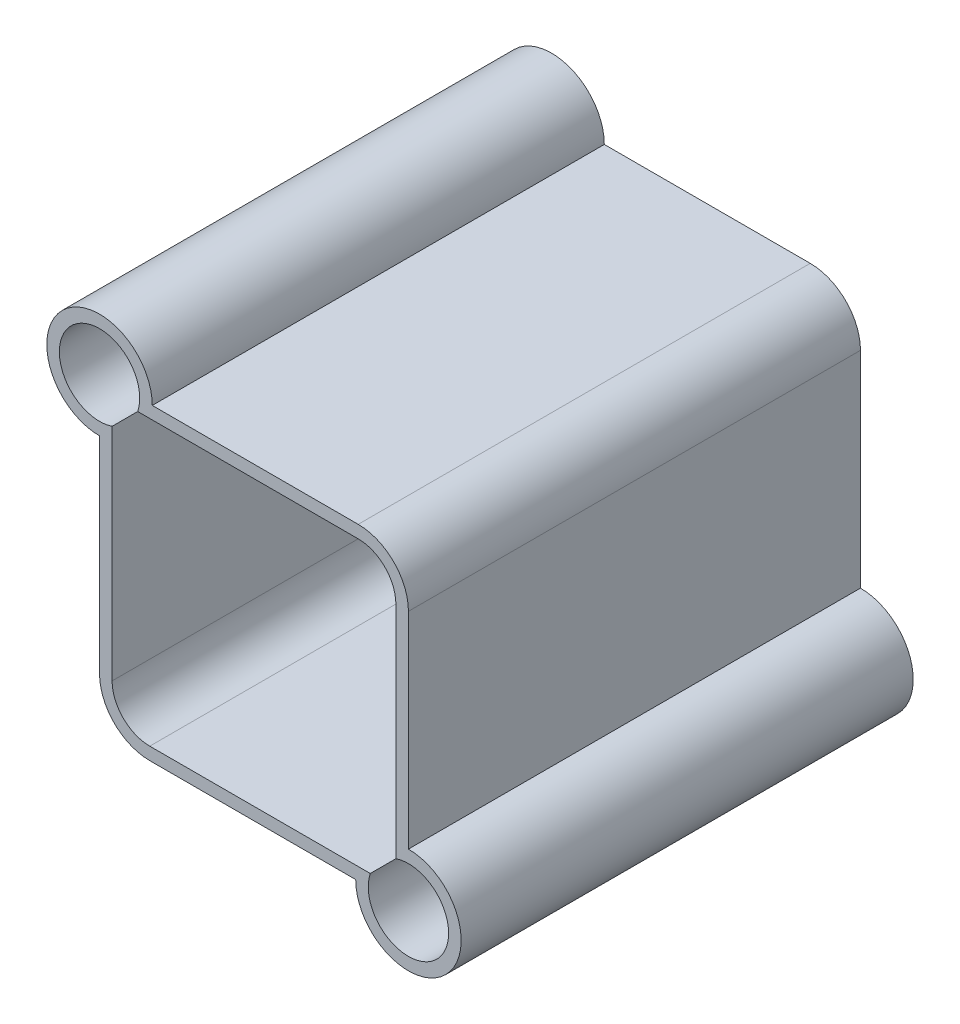
ISO-10303-21;
HEADER;
FILE_DESCRIPTION(('STEP AP214'),'2;1');
FILE_NAME('part.step','',(''),(''),'','','');
FILE_SCHEMA(('AUTOMOTIVE_DESIGN { 1 0 10303 214 1 1 1 1 }'));
ENDSEC;
DATA;
#1=APPLICATION_CONTEXT('core data for automotive mechanical design processes');
#2=APPLICATION_PROTOCOL_DEFINITION('international standard','automotive_design',2000,#1);
#3=PRODUCT_CONTEXT('',#1,'mechanical');
#4=PRODUCT('Part','Part','',(#3));
#5=PRODUCT_RELATED_PRODUCT_CATEGORY('part','',(#4));
#6=PRODUCT_DEFINITION_FORMATION('','',#4);
#7=PRODUCT_DEFINITION_CONTEXT('part definition',#1,'design');
#8=PRODUCT_DEFINITION('design','',#6,#7);
#9=PRODUCT_DEFINITION_SHAPE('','',#8);
#10=(LENGTH_UNIT() NAMED_UNIT(*) SI_UNIT(.MILLI.,.METRE.));
#11=(NAMED_UNIT(*) PLANE_ANGLE_UNIT() SI_UNIT($,.RADIAN.));
#12=(NAMED_UNIT(*) SI_UNIT($,.STERADIAN.) SOLID_ANGLE_UNIT());
#13=UNCERTAINTY_MEASURE_WITH_UNIT(LENGTH_MEASURE(1.E-05),#10,'distance_accuracy_value','');
#14=(GEOMETRIC_REPRESENTATION_CONTEXT(3) GLOBAL_UNCERTAINTY_ASSIGNED_CONTEXT((#13)) GLOBAL_UNIT_ASSIGNED_CONTEXT((#10,
#11,#12)) REPRESENTATION_CONTEXT('',''));
#15=CARTESIAN_POINT('',(0.,0.,0.));
#16=DIRECTION('',(0.,0.,1.));
#17=DIRECTION('',(1.,0.,0.));
#18=AXIS2_PLACEMENT_3D('',#15,#16,#17);
#19=CARTESIAN_POINT('',(-6.15,6.15,30.5));
#20=DIRECTION('',(0.,0.,1.));
#21=DIRECTION('',(1.,0.,0.));
#22=AXIS2_PLACEMENT_3D('',#19,#20,#21);
#23=PLANE('',#22);
#24=CARTESIAN_POINT('',(-6.15,6.15,30.5));
#25=DIRECTION('',(0.,0.,1.));
#26=DIRECTION('',(1.,0.,0.));
#27=AXIS2_PLACEMENT_3D('',#24,#25,#26);
#28=CIRCLE('',#27,2.1);
#29=CARTESIAN_POINT('',(-4.05,6.15,30.5));
#30=VERTEX_POINT('',#29);
#31=CARTESIAN_POINT('',(-6.15,4.05,30.5));
#32=VERTEX_POINT('',#31);
#33=EDGE_CURVE('E220',#30,#32,#28,.T.);
#34=ORIENTED_EDGE('',*,*,#33,.T.);
#35=DIRECTION('',(0.,-1.,0.));
#36=VECTOR('',#35,1.);
#37=CARTESIAN_POINT('',(-6.15,4.05,30.5));
#38=LINE('',#37,#36);
#39=CARTESIAN_POINT('',(-6.15,-4.15,30.5));
#40=VERTEX_POINT('',#39);
#41=EDGE_CURVE('E223',#32,#40,#38,.T.);
#42=ORIENTED_EDGE('',*,*,#41,.T.);
#43=CARTESIAN_POINT('',(-4.15,-4.15,30.5));
#44=DIRECTION('',(0.,0.,1.));
#45=DIRECTION('',(1.,0.,0.));
#46=AXIS2_PLACEMENT_3D('',#43,#44,#45);
#47=CIRCLE('',#46,2.);
#48=CARTESIAN_POINT('',(-4.15,-6.15,30.5));
#49=VERTEX_POINT('',#48);
#50=EDGE_CURVE('E226',#40,#49,#47,.T.);
#51=ORIENTED_EDGE('',*,*,#50,.T.);
#52=DIRECTION('',(1.,0.,0.));
#53=VECTOR('',#52,1.);
#54=CARTESIAN_POINT('',(-4.15,-6.15,30.5));
#55=LINE('',#54,#53);
#56=CARTESIAN_POINT('',(4.05,-6.15,30.5));
#57=VERTEX_POINT('',#56);
#58=EDGE_CURVE('E228',#49,#57,#55,.T.);
#59=ORIENTED_EDGE('',*,*,#58,.T.);
#60=CARTESIAN_POINT('',(6.15,-6.15,30.5));
#61=DIRECTION('',(0.,0.,1.));
#62=DIRECTION('',(1.,0.,0.));
#63=AXIS2_PLACEMENT_3D('',#60,#61,#62);
#64=CIRCLE('',#63,2.1);
#65=CARTESIAN_POINT('',(6.15,-4.05,30.5));
#66=VERTEX_POINT('',#65);
#67=EDGE_CURVE('E230',#57,#66,#64,.T.);
#68=ORIENTED_EDGE('',*,*,#67,.T.);
#69=DIRECTION('',(0.,1.,0.));
#70=VECTOR('',#69,1.);
#71=CARTESIAN_POINT('',(6.15,-4.05,30.5));
#72=LINE('',#71,#70);
#73=CARTESIAN_POINT('',(6.15,4.15,30.5));
#74=VERTEX_POINT('',#73);
#75=EDGE_CURVE('E232',#66,#74,#72,.T.);
#76=ORIENTED_EDGE('',*,*,#75,.T.);
#77=CARTESIAN_POINT('',(4.15,4.15,30.5));
#78=DIRECTION('',(0.,0.,1.));
#79=DIRECTION('',(1.,0.,0.));
#80=AXIS2_PLACEMENT_3D('',#77,#78,#79);
#81=CIRCLE('',#80,2.);
#82=CARTESIAN_POINT('',(4.15,6.15,30.5));
#83=VERTEX_POINT('',#82);
#84=EDGE_CURVE('E234',#74,#83,#81,.T.);
#85=ORIENTED_EDGE('',*,*,#84,.T.);
#86=DIRECTION('',(-1.,0.,0.));
#87=VECTOR('',#86,1.);
#88=CARTESIAN_POINT('',(4.15,6.15,30.5));
#89=LINE('',#88,#87);
#90=EDGE_CURVE('E236',#83,#30,#89,.T.);
#91=ORIENTED_EDGE('',*,*,#90,.T.);
#92=EDGE_LOOP('',(#34,#42,#51,#59,#68,#76,#85,#91));
#93=FACE_BOUND('',#92,.T.);
#94=DIRECTION('',(-1.,0.,0.));
#95=VECTOR('',#94,1.);
#96=CARTESIAN_POINT('',(4.15,5.65,30.5));
#97=LINE('',#96,#95);
#98=CARTESIAN_POINT('',(4.15,5.65,30.5));
#99=VERTEX_POINT('',#98);
#100=CARTESIAN_POINT('',(-4.63013158464293,5.65,30.5));
#101=VERTEX_POINT('',#100);
#102=EDGE_CURVE('E162',#99,#101,#97,.T.);
#103=ORIENTED_EDGE('',*,*,#102,.F.);
#104=CARTESIAN_POINT('',(4.15,4.15,30.5));
#105=DIRECTION('',(0.,0.,1.));
#106=DIRECTION('',(1.,0.,0.));
#107=AXIS2_PLACEMENT_3D('',#104,#105,#106);
#108=CIRCLE('',#107,1.5);
#109=CARTESIAN_POINT('',(5.65,4.15,30.5));
#110=VERTEX_POINT('',#109);
#111=EDGE_CURVE('E154',#110,#99,#108,.T.);
#112=ORIENTED_EDGE('',*,*,#111,.F.);
#113=DIRECTION('',(0.,1.,0.));
#114=VECTOR('',#113,1.);
#115=CARTESIAN_POINT('',(5.65,-4.63013158464293,30.5));
#116=LINE('',#115,#114);
#117=CARTESIAN_POINT('',(5.65,-4.63013158464293,30.5));
#118=VERTEX_POINT('',#117);
#119=EDGE_CURVE('E188',#118,#110,#116,.T.);
#120=ORIENTED_EDGE('',*,*,#119,.F.);
#121=CARTESIAN_POINT('',(6.15,-6.15,30.5));
#122=DIRECTION('',(0.,0.,1.));
#123=DIRECTION('',(1.,0.,0.));
#124=AXIS2_PLACEMENT_3D('',#121,#122,#123);
#125=CIRCLE('',#124,1.6);
#126=CARTESIAN_POINT('',(4.63013158464293,-5.65,30.5));
#127=VERTEX_POINT('',#126);
#128=EDGE_CURVE('E186',#127,#118,#125,.T.);
#129=ORIENTED_EDGE('',*,*,#128,.F.);
#130=DIRECTION('',(1.,0.,0.));
#131=VECTOR('',#130,1.);
#132=CARTESIAN_POINT('',(-4.15,-5.65,30.5));
#133=LINE('',#132,#131);
#134=CARTESIAN_POINT('',(-4.15,-5.65,30.5));
#135=VERTEX_POINT('',#134);
#136=EDGE_CURVE('E184',#135,#127,#133,.T.);
#137=ORIENTED_EDGE('',*,*,#136,.F.);
#138=CARTESIAN_POINT('',(-4.15,-4.15,30.5));
#139=DIRECTION('',(0.,0.,1.));
#140=DIRECTION('',(1.,0.,0.));
#141=AXIS2_PLACEMENT_3D('',#138,#139,#140);
#142=CIRCLE('',#141,1.5);
#143=CARTESIAN_POINT('',(-5.65,-4.15,30.5));
#144=VERTEX_POINT('',#143);
#145=EDGE_CURVE('E182',#144,#135,#142,.T.);
#146=ORIENTED_EDGE('',*,*,#145,.F.);
#147=DIRECTION('',(0.,-1.,0.));
#148=VECTOR('',#147,1.);
#149=CARTESIAN_POINT('',(-5.65,4.63013158464293,30.5));
#150=LINE('',#149,#148);
#151=CARTESIAN_POINT('',(-5.65,4.63013158464293,30.5));
#152=VERTEX_POINT('',#151);
#153=EDGE_CURVE('E178',#152,#144,#150,.T.);
#154=ORIENTED_EDGE('',*,*,#153,.F.);
#155=CARTESIAN_POINT('',(-6.15,6.15,30.5));
#156=DIRECTION('',(0.,0.,1.));
#157=DIRECTION('',(1.,0.,0.));
#158=AXIS2_PLACEMENT_3D('',#155,#156,#157);
#159=CIRCLE('',#158,1.6);
#160=EDGE_CURVE('E176',#101,#152,#159,.T.);
#161=ORIENTED_EDGE('',*,*,#160,.F.);
#162=EDGE_LOOP('',(#103,#112,#120,#129,#137,#146,#154,#161));
#163=FACE_BOUND('',#162,.T.);
#164=ADVANCED_FACE('F41',(#93,#163),#23,.T.);
#165=CARTESIAN_POINT('',(-6.15,6.15,12.5));
#166=DIRECTION('',(0.,0.,1.));
#167=DIRECTION('',(1.,0.,0.));
#168=AXIS2_PLACEMENT_3D('',#165,#166,#167);
#169=PLANE('',#168);
#170=DIRECTION('',(0.,-1.,0.));
#171=VECTOR('',#170,1.);
#172=CARTESIAN_POINT('',(-6.15,4.05,12.5));
#173=LINE('',#172,#171);
#174=CARTESIAN_POINT('',(-6.15,4.05,12.5));
#175=VERTEX_POINT('',#174);
#176=CARTESIAN_POINT('',(-6.15,-4.15,12.5));
#177=VERTEX_POINT('',#176);
#178=EDGE_CURVE('E171',#175,#177,#173,.T.);
#179=ORIENTED_EDGE('',*,*,#178,.F.);
#180=CARTESIAN_POINT('',(-6.15,6.15,12.5));
#181=DIRECTION('',(0.,0.,1.));
#182=DIRECTION('',(1.,0.,0.));
#183=AXIS2_PLACEMENT_3D('',#180,#181,#182);
#184=CIRCLE('',#183,2.1);
#185=CARTESIAN_POINT('',(-4.05,6.15,12.5));
#186=VERTEX_POINT('',#185);
#187=EDGE_CURVE('E224',#186,#175,#184,.T.);
#188=ORIENTED_EDGE('',*,*,#187,.F.);
#189=DIRECTION('',(-1.,0.,0.));
#190=VECTOR('',#189,1.);
#191=CARTESIAN_POINT('',(4.15,6.15,12.5));
#192=LINE('',#191,#190);
#193=CARTESIAN_POINT('',(4.15,6.15,12.5));
#194=VERTEX_POINT('',#193);
#195=EDGE_CURVE('E251',#194,#186,#192,.T.);
#196=ORIENTED_EDGE('',*,*,#195,.F.);
#197=CARTESIAN_POINT('',(4.15,4.15,12.5));
#198=DIRECTION('',(0.,0.,1.));
#199=DIRECTION('',(1.,0.,0.));
#200=AXIS2_PLACEMENT_3D('',#197,#198,#199);
#201=CIRCLE('',#200,2.);
#202=CARTESIAN_POINT('',(6.15,4.15,12.5));
#203=VERTEX_POINT('',#202);
#204=EDGE_CURVE('E249',#203,#194,#201,.T.);
#205=ORIENTED_EDGE('',*,*,#204,.F.);
#206=DIRECTION('',(0.,1.,0.));
#207=VECTOR('',#206,1.);
#208=CARTESIAN_POINT('',(6.15,-4.05,12.5));
#209=LINE('',#208,#207);
#210=CARTESIAN_POINT('',(6.15,-4.05,12.5));
#211=VERTEX_POINT('',#210);
#212=EDGE_CURVE('E247',#211,#203,#209,.T.);
#213=ORIENTED_EDGE('',*,*,#212,.F.);
#214=CARTESIAN_POINT('',(6.15,-6.15,12.5));
#215=DIRECTION('',(0.,0.,1.));
#216=DIRECTION('',(1.,0.,0.));
#217=AXIS2_PLACEMENT_3D('',#214,#215,#216);
#218=CIRCLE('',#217,2.1);
#219=CARTESIAN_POINT('',(4.05,-6.15,12.5));
#220=VERTEX_POINT('',#219);
#221=EDGE_CURVE('E245',#220,#211,#218,.T.);
#222=ORIENTED_EDGE('',*,*,#221,.F.);
#223=DIRECTION('',(1.,0.,0.));
#224=VECTOR('',#223,1.);
#225=CARTESIAN_POINT('',(-4.15,-6.15,12.5));
#226=LINE('',#225,#224);
#227=CARTESIAN_POINT('',(-4.15,-6.15,12.5));
#228=VERTEX_POINT('',#227);
#229=EDGE_CURVE('E243',#228,#220,#226,.T.);
#230=ORIENTED_EDGE('',*,*,#229,.F.);
#231=CARTESIAN_POINT('',(-4.15,-4.15,12.5));
#232=DIRECTION('',(0.,0.,1.));
#233=DIRECTION('',(1.,0.,0.));
#234=AXIS2_PLACEMENT_3D('',#231,#232,#233);
#235=CIRCLE('',#234,2.);
#236=EDGE_CURVE('E241',#177,#228,#235,.T.);
#237=ORIENTED_EDGE('',*,*,#236,.F.);
#238=EDGE_LOOP('',(#179,#188,#196,#205,#213,#222,#230,#237));
#239=FACE_BOUND('',#238,.T.);
#240=CARTESIAN_POINT('',(4.15,4.15,12.5));
#241=DIRECTION('',(0.,0.,1.));
#242=DIRECTION('',(1.,0.,0.));
#243=AXIS2_PLACEMENT_3D('',#240,#241,#242);
#244=CIRCLE('',#243,1.5);
#245=CARTESIAN_POINT('',(5.65,4.15,12.5));
#246=VERTEX_POINT('',#245);
#247=CARTESIAN_POINT('',(4.15,5.65,12.5));
#248=VERTEX_POINT('',#247);
#249=EDGE_CURVE('E64',#246,#248,#244,.T.);
#250=ORIENTED_EDGE('',*,*,#249,.T.);
#251=DIRECTION('',(-1.,0.,0.));
#252=VECTOR('',#251,1.);
#253=CARTESIAN_POINT('',(4.15,5.65,12.5));
#254=LINE('',#253,#252);
#255=CARTESIAN_POINT('',(-4.63013158464293,5.65,12.5));
#256=VERTEX_POINT('',#255);
#257=EDGE_CURVE('E170',#248,#256,#254,.T.);
#258=ORIENTED_EDGE('',*,*,#257,.T.);
#259=CARTESIAN_POINT('',(-6.15,6.15,12.5));
#260=DIRECTION('',(0.,0.,1.));
#261=DIRECTION('',(1.,0.,0.));
#262=AXIS2_PLACEMENT_3D('',#259,#260,#261);
#263=CIRCLE('',#262,1.6);
#264=CARTESIAN_POINT('',(-5.65,4.63013158464293,12.5));
#265=VERTEX_POINT('',#264);
#266=EDGE_CURVE('E192',#256,#265,#263,.T.);
#267=ORIENTED_EDGE('',*,*,#266,.T.);
#268=DIRECTION('',(0.,-1.,0.));
#269=VECTOR('',#268,1.);
#270=CARTESIAN_POINT('',(-5.65,4.63013158464293,12.5));
#271=LINE('',#270,#269);
#272=CARTESIAN_POINT('',(-5.65,-4.15,12.5));
#273=VERTEX_POINT('',#272);
#274=EDGE_CURVE('E195',#265,#273,#271,.T.);
#275=ORIENTED_EDGE('',*,*,#274,.T.);
#276=CARTESIAN_POINT('',(-4.15,-4.15,12.5));
#277=DIRECTION('',(0.,0.,1.));
#278=DIRECTION('',(1.,0.,0.));
#279=AXIS2_PLACEMENT_3D('',#276,#277,#278);
#280=CIRCLE('',#279,1.5);
#281=CARTESIAN_POINT('',(-4.15,-5.65,12.5));
#282=VERTEX_POINT('',#281);
#283=EDGE_CURVE('E198',#273,#282,#280,.T.);
#284=ORIENTED_EDGE('',*,*,#283,.T.);
#285=DIRECTION('',(1.,0.,0.));
#286=VECTOR('',#285,1.);
#287=CARTESIAN_POINT('',(-4.15,-5.65,12.5));
#288=LINE('',#287,#286);
#289=CARTESIAN_POINT('',(4.63013158464293,-5.65,12.5));
#290=VERTEX_POINT('',#289);
#291=EDGE_CURVE('E201',#282,#290,#288,.T.);
#292=ORIENTED_EDGE('',*,*,#291,.T.);
#293=CARTESIAN_POINT('',(6.15,-6.15,12.5));
#294=DIRECTION('',(0.,0.,1.));
#295=DIRECTION('',(1.,0.,0.));
#296=AXIS2_PLACEMENT_3D('',#293,#294,#295);
#297=CIRCLE('',#296,1.6);
#298=CARTESIAN_POINT('',(5.65,-4.63013158464293,12.5));
#299=VERTEX_POINT('',#298);
#300=EDGE_CURVE('E204',#290,#299,#297,.T.);
#301=ORIENTED_EDGE('',*,*,#300,.T.);
#302=DIRECTION('',(0.,1.,0.));
#303=VECTOR('',#302,1.);
#304=CARTESIAN_POINT('',(5.65,-4.63013158464293,12.5));
#305=LINE('',#304,#303);
#306=EDGE_CURVE('E163',#299,#246,#305,.T.);
#307=ORIENTED_EDGE('',*,*,#306,.T.);
#308=EDGE_LOOP('',(#250,#258,#267,#275,#284,#292,#301,#307));
#309=FACE_BOUND('',#308,.T.);
#310=ADVANCED_FACE('F281',(#239,#309),#169,.F.);
#311=CARTESIAN_POINT('',(-6.15,4.05,30.5));
#312=DIRECTION('',(1.,0.,0.));
#313=DIRECTION('',(0.,0.,-1.));
#314=AXIS2_PLACEMENT_3D('',#311,#312,#313);
#315=PLANE('',#314);
#316=ORIENTED_EDGE('',*,*,#178,.T.);
#317=DIRECTION('',(0.,0.,-1.));
#318=VECTOR('',#317,1.);
#319=CARTESIAN_POINT('',(-6.15,-4.15,30.5));
#320=LINE('',#319,#318);
#321=EDGE_CURVE('E49',#40,#177,#320,.T.);
#322=ORIENTED_EDGE('',*,*,#321,.F.);
#323=ORIENTED_EDGE('',*,*,#41,.F.);
#324=DIRECTION('',(0.,0.,-1.));
#325=VECTOR('',#324,1.);
#326=CARTESIAN_POINT('',(-6.15,4.05,30.5));
#327=LINE('',#326,#325);
#328=EDGE_CURVE('E11',#32,#175,#327,.T.);
#329=ORIENTED_EDGE('',*,*,#328,.T.);
#330=EDGE_LOOP('',(#316,#322,#323,#329));
#331=FACE_BOUND('',#330,.T.);
#332=ADVANCED_FACE('F43',(#331),#315,.F.);
#333=CARTESIAN_POINT('',(-4.15,-4.15,30.5));
#334=DIRECTION('',(0.,0.,-1.));
#335=DIRECTION('',(-1.,0.,0.));
#336=AXIS2_PLACEMENT_3D('',#333,#334,#335);
#337=CYLINDRICAL_SURFACE('',#336,2.);
#338=ORIENTED_EDGE('',*,*,#236,.T.);
#339=DIRECTION('',(0.,0.,-1.));
#340=VECTOR('',#339,1.);
#341=CARTESIAN_POINT('',(-4.15,-6.15,30.5));
#342=LINE('',#341,#340);
#343=EDGE_CURVE('E268',#49,#228,#342,.T.);
#344=ORIENTED_EDGE('',*,*,#343,.F.);
#345=ORIENTED_EDGE('',*,*,#50,.F.);
#346=ORIENTED_EDGE('',*,*,#321,.T.);
#347=EDGE_LOOP('',(#338,#344,#345,#346));
#348=FACE_BOUND('',#347,.T.);
#349=ADVANCED_FACE('F275',(#348),#337,.T.);
#350=CARTESIAN_POINT('',(-4.15,-6.15,30.5));
#351=DIRECTION('',(0.,1.,0.));
#352=DIRECTION('',(0.,0.,1.));
#353=AXIS2_PLACEMENT_3D('',#350,#351,#352);
#354=PLANE('',#353);
#355=ORIENTED_EDGE('',*,*,#229,.T.);
#356=DIRECTION('',(0.,0.,-1.));
#357=VECTOR('',#356,1.);
#358=CARTESIAN_POINT('',(4.05,-6.15,30.5));
#359=LINE('',#358,#357);
#360=EDGE_CURVE('E265',#57,#220,#359,.T.);
#361=ORIENTED_EDGE('',*,*,#360,.F.);
#362=ORIENTED_EDGE('',*,*,#58,.F.);
#363=ORIENTED_EDGE('',*,*,#343,.T.);
#364=EDGE_LOOP('',(#355,#361,#362,#363));
#365=FACE_BOUND('',#364,.T.);
#366=ADVANCED_FACE('F288',(#365),#354,.F.);
#367=CARTESIAN_POINT('',(6.15,-6.15,30.5));
#368=DIRECTION('',(0.,0.,-1.));
#369=DIRECTION('',(-1.,0.,0.));
#370=AXIS2_PLACEMENT_3D('',#367,#368,#369);
#371=CYLINDRICAL_SURFACE('',#370,2.1);
#372=ORIENTED_EDGE('',*,*,#221,.T.);
#373=DIRECTION('',(0.,0.,-1.));
#374=VECTOR('',#373,1.);
#375=CARTESIAN_POINT('',(6.15,-4.05,30.5));
#376=LINE('',#375,#374);
#377=EDGE_CURVE('E262',#66,#211,#376,.T.);
#378=ORIENTED_EDGE('',*,*,#377,.F.);
#379=ORIENTED_EDGE('',*,*,#67,.F.);
#380=ORIENTED_EDGE('',*,*,#360,.T.);
#381=EDGE_LOOP('',(#372,#378,#379,#380));
#382=FACE_BOUND('',#381,.T.);
#383=ADVANCED_FACE('F292',(#382),#371,.T.);
#384=CARTESIAN_POINT('',(6.15,-4.05,30.5));
#385=DIRECTION('',(-1.,0.,0.));
#386=DIRECTION('',(0.,0.,1.));
#387=AXIS2_PLACEMENT_3D('',#384,#385,#386);
#388=PLANE('',#387);
#389=ORIENTED_EDGE('',*,*,#212,.T.);
#390=DIRECTION('',(0.,0.,-1.));
#391=VECTOR('',#390,1.);
#392=CARTESIAN_POINT('',(6.15,4.15,30.5));
#393=LINE('',#392,#391);
#394=EDGE_CURVE('E259',#74,#203,#393,.T.);
#395=ORIENTED_EDGE('',*,*,#394,.F.);
#396=ORIENTED_EDGE('',*,*,#75,.F.);
#397=ORIENTED_EDGE('',*,*,#377,.T.);
#398=EDGE_LOOP('',(#389,#395,#396,#397));
#399=FACE_BOUND('',#398,.T.);
#400=ADVANCED_FACE('F311',(#399),#388,.F.);
#401=CARTESIAN_POINT('',(4.15,4.15,30.5));
#402=DIRECTION('',(0.,0.,-1.));
#403=DIRECTION('',(-1.,0.,0.));
#404=AXIS2_PLACEMENT_3D('',#401,#402,#403);
#405=CYLINDRICAL_SURFACE('',#404,2.);
#406=ORIENTED_EDGE('',*,*,#204,.T.);
#407=DIRECTION('',(0.,0.,-1.));
#408=VECTOR('',#407,1.);
#409=CARTESIAN_POINT('',(4.15,6.15,30.5));
#410=LINE('',#409,#408);
#411=EDGE_CURVE('E256',#83,#194,#410,.T.);
#412=ORIENTED_EDGE('',*,*,#411,.F.);
#413=ORIENTED_EDGE('',*,*,#84,.F.);
#414=ORIENTED_EDGE('',*,*,#394,.T.);
#415=EDGE_LOOP('',(#406,#412,#413,#414));
#416=FACE_BOUND('',#415,.T.);
#417=ADVANCED_FACE('F309',(#416),#405,.T.);
#418=CARTESIAN_POINT('',(4.15,6.15,30.5));
#419=DIRECTION('',(0.,-1.,0.));
#420=DIRECTION('',(0.,0.,-1.));
#421=AXIS2_PLACEMENT_3D('',#418,#419,#420);
#422=PLANE('',#421);
#423=ORIENTED_EDGE('',*,*,#195,.T.);
#424=DIRECTION('',(0.,0.,-1.));
#425=VECTOR('',#424,1.);
#426=CARTESIAN_POINT('',(-4.05,6.15,30.5));
#427=LINE('',#426,#425);
#428=EDGE_CURVE('E239',#30,#186,#427,.T.);
#429=ORIENTED_EDGE('',*,*,#428,.F.);
#430=ORIENTED_EDGE('',*,*,#90,.F.);
#431=ORIENTED_EDGE('',*,*,#411,.T.);
#432=EDGE_LOOP('',(#423,#429,#430,#431));
#433=FACE_BOUND('',#432,.T.);
#434=ADVANCED_FACE('F304',(#433),#422,.F.);
#435=CARTESIAN_POINT('',(-6.15,6.15,30.5));
#436=DIRECTION('',(0.,0.,-1.));
#437=DIRECTION('',(-1.,0.,0.));
#438=AXIS2_PLACEMENT_3D('',#435,#436,#437);
#439=CYLINDRICAL_SURFACE('',#438,2.1);
#440=ORIENTED_EDGE('',*,*,#187,.T.);
#441=ORIENTED_EDGE('',*,*,#328,.F.);
#442=ORIENTED_EDGE('',*,*,#33,.F.);
#443=ORIENTED_EDGE('',*,*,#428,.T.);
#444=EDGE_LOOP('',(#440,#441,#442,#443));
#445=FACE_BOUND('',#444,.T.);
#446=ADVANCED_FACE('F299',(#445),#439,.T.);
#447=CARTESIAN_POINT('',(4.15,4.15,30.5));
#448=DIRECTION('',(0.,0.,-1.));
#449=DIRECTION('',(-1.,0.,0.));
#450=AXIS2_PLACEMENT_3D('',#447,#448,#449);
#451=CYLINDRICAL_SURFACE('',#450,1.5);
#452=ORIENTED_EDGE('',*,*,#249,.F.);
#453=DIRECTION('',(0.,0.,-1.));
#454=VECTOR('',#453,1.);
#455=CARTESIAN_POINT('',(5.65,4.15,30.5));
#456=LINE('',#455,#454);
#457=EDGE_CURVE('E158',#110,#246,#456,.T.);
#458=ORIENTED_EDGE('',*,*,#457,.F.);
#459=ORIENTED_EDGE('',*,*,#111,.T.);
#460=DIRECTION('',(0.,0.,-1.));
#461=VECTOR('',#460,1.);
#462=CARTESIAN_POINT('',(4.15,5.65,30.5));
#463=LINE('',#462,#461);
#464=EDGE_CURVE('E157',#99,#248,#463,.T.);
#465=ORIENTED_EDGE('',*,*,#464,.T.);
#466=EDGE_LOOP('',(#452,#458,#459,#465));
#467=FACE_BOUND('',#466,.T.);
#468=ADVANCED_FACE('F156',(#467),#451,.F.);
#469=CARTESIAN_POINT('',(4.15,5.65,30.5));
#470=DIRECTION('',(0.,-1.,0.));
#471=DIRECTION('',(0.,0.,-1.));
#472=AXIS2_PLACEMENT_3D('',#469,#470,#471);
#473=PLANE('',#472);
#474=ORIENTED_EDGE('',*,*,#257,.F.);
#475=ORIENTED_EDGE('',*,*,#464,.F.);
#476=ORIENTED_EDGE('',*,*,#102,.T.);
#477=DIRECTION('',(0.,0.,-1.));
#478=VECTOR('',#477,1.);
#479=CARTESIAN_POINT('',(-4.63013158464293,5.65,30.5));
#480=LINE('',#479,#478);
#481=EDGE_CURVE('E172',#101,#256,#480,.T.);
#482=ORIENTED_EDGE('',*,*,#481,.T.);
#483=EDGE_LOOP('',(#474,#475,#476,#482));
#484=FACE_BOUND('',#483,.T.);
#485=ADVANCED_FACE('F166',(#484),#473,.T.);
#486=CARTESIAN_POINT('',(-6.15,6.15,30.5));
#487=DIRECTION('',(0.,0.,-1.));
#488=DIRECTION('',(-1.,0.,0.));
#489=AXIS2_PLACEMENT_3D('',#486,#487,#488);
#490=CYLINDRICAL_SURFACE('',#489,1.6);
#491=ORIENTED_EDGE('',*,*,#266,.F.);
#492=ORIENTED_EDGE('',*,*,#481,.F.);
#493=ORIENTED_EDGE('',*,*,#160,.T.);
#494=DIRECTION('',(0.,0.,-1.));
#495=VECTOR('',#494,1.);
#496=CARTESIAN_POINT('',(-5.65,4.63013158464293,30.5));
#497=LINE('',#496,#495);
#498=EDGE_CURVE('E217',#152,#265,#497,.T.);
#499=ORIENTED_EDGE('',*,*,#498,.T.);
#500=EDGE_LOOP('',(#491,#492,#493,#499));
#501=FACE_BOUND('',#500,.T.);
#502=ADVANCED_FACE('F354',(#501),#490,.F.);
#503=CARTESIAN_POINT('',(-5.65,4.63013158464293,30.5));
#504=DIRECTION('',(1.,0.,0.));
#505=DIRECTION('',(0.,0.,-1.));
#506=AXIS2_PLACEMENT_3D('',#503,#504,#505);
#507=PLANE('',#506);
#508=ORIENTED_EDGE('',*,*,#274,.F.);
#509=ORIENTED_EDGE('',*,*,#498,.F.);
#510=ORIENTED_EDGE('',*,*,#153,.T.);
#511=DIRECTION('',(0.,0.,-1.));
#512=VECTOR('',#511,1.);
#513=CARTESIAN_POINT('',(-5.65,-4.15,30.5));
#514=LINE('',#513,#512);
#515=EDGE_CURVE('E215',#144,#273,#514,.T.);
#516=ORIENTED_EDGE('',*,*,#515,.T.);
#517=EDGE_LOOP('',(#508,#509,#510,#516));
#518=FACE_BOUND('',#517,.T.);
#519=ADVANCED_FACE('F362',(#518),#507,.T.);
#520=CARTESIAN_POINT('',(-4.15,-4.15,30.5));
#521=DIRECTION('',(0.,0.,-1.));
#522=DIRECTION('',(-1.,0.,0.));
#523=AXIS2_PLACEMENT_3D('',#520,#521,#522);
#524=CYLINDRICAL_SURFACE('',#523,1.5);
#525=ORIENTED_EDGE('',*,*,#283,.F.);
#526=ORIENTED_EDGE('',*,*,#515,.F.);
#527=ORIENTED_EDGE('',*,*,#145,.T.);
#528=DIRECTION('',(0.,0.,-1.));
#529=VECTOR('',#528,1.);
#530=CARTESIAN_POINT('',(-4.15,-5.65,30.5));
#531=LINE('',#530,#529);
#532=EDGE_CURVE('E213',#135,#282,#531,.T.);
#533=ORIENTED_EDGE('',*,*,#532,.T.);
#534=EDGE_LOOP('',(#525,#526,#527,#533));
#535=FACE_BOUND('',#534,.T.);
#536=ADVANCED_FACE('F370',(#535),#524,.F.);
#537=CARTESIAN_POINT('',(-4.15,-5.65,30.5));
#538=DIRECTION('',(0.,1.,0.));
#539=DIRECTION('',(0.,0.,1.));
#540=AXIS2_PLACEMENT_3D('',#537,#538,#539);
#541=PLANE('',#540);
#542=ORIENTED_EDGE('',*,*,#291,.F.);
#543=ORIENTED_EDGE('',*,*,#532,.F.);
#544=ORIENTED_EDGE('',*,*,#136,.T.);
#545=DIRECTION('',(0.,0.,-1.));
#546=VECTOR('',#545,1.);
#547=CARTESIAN_POINT('',(4.63013158464293,-5.65,30.5));
#548=LINE('',#547,#546);
#549=EDGE_CURVE('E211',#127,#290,#548,.T.);
#550=ORIENTED_EDGE('',*,*,#549,.T.);
#551=EDGE_LOOP('',(#542,#543,#544,#550));
#552=FACE_BOUND('',#551,.T.);
#553=ADVANCED_FACE('F379',(#552),#541,.T.);
#554=CARTESIAN_POINT('',(6.15,-6.15,30.5));
#555=DIRECTION('',(0.,0.,-1.));
#556=DIRECTION('',(-1.,0.,0.));
#557=AXIS2_PLACEMENT_3D('',#554,#555,#556);
#558=CYLINDRICAL_SURFACE('',#557,1.6);
#559=ORIENTED_EDGE('',*,*,#300,.F.);
#560=ORIENTED_EDGE('',*,*,#549,.F.);
#561=ORIENTED_EDGE('',*,*,#128,.T.);
#562=DIRECTION('',(0.,0.,-1.));
#563=VECTOR('',#562,1.);
#564=CARTESIAN_POINT('',(5.65,-4.63013158464293,30.5));
#565=LINE('',#564,#563);
#566=EDGE_CURVE('E56',#118,#299,#565,.T.);
#567=ORIENTED_EDGE('',*,*,#566,.T.);
#568=EDGE_LOOP('',(#559,#560,#561,#567));
#569=FACE_BOUND('',#568,.T.);
#570=ADVANCED_FACE('F388',(#569),#558,.F.);
#571=CARTESIAN_POINT('',(5.65,-4.63013158464293,30.5));
#572=DIRECTION('',(-1.,0.,0.));
#573=DIRECTION('',(0.,-1.,0.));
#574=AXIS2_PLACEMENT_3D('',#571,#572,#573);
#575=PLANE('',#574);
#576=ORIENTED_EDGE('',*,*,#306,.F.);
#577=ORIENTED_EDGE('',*,*,#566,.F.);
#578=ORIENTED_EDGE('',*,*,#119,.T.);
#579=ORIENTED_EDGE('',*,*,#457,.T.);
#580=EDGE_LOOP('',(#576,#577,#578,#579));
#581=FACE_BOUND('',#580,.T.);
#582=ADVANCED_FACE('F397',(#581),#575,.T.);
#583=CLOSED_SHELL('',(#164,#310,#332,#349,#366,#383,#400,#417,#434,#446,#468,#485,#502,#519,
#536,#553,#570,#582));
#584=MANIFOLD_SOLID_BREP('B2',#583);
#585=ADVANCED_BREP_SHAPE_REPRESENTATION('',(#18,#584),#14);
#586=SHAPE_DEFINITION_REPRESENTATION(#9,#585);
ENDSEC;
END-ISO-10303-21;
